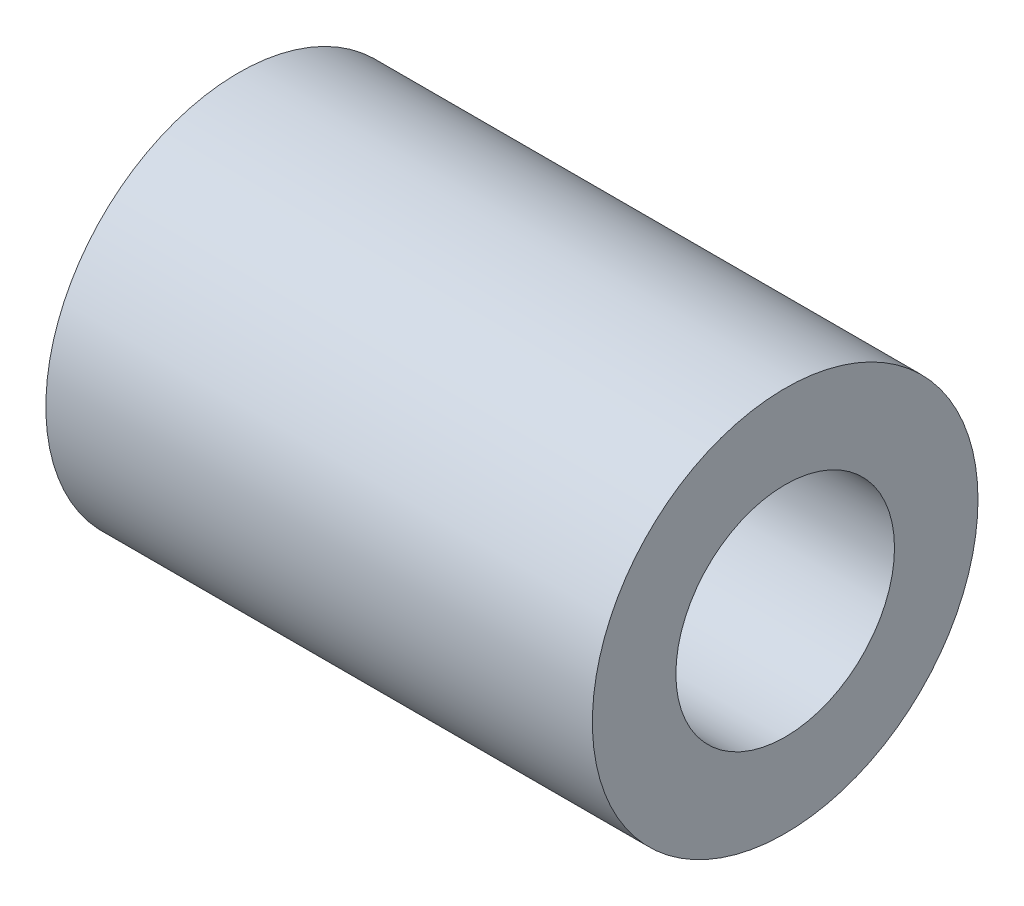
ISO-10303-21;
HEADER;
FILE_DESCRIPTION(('STEP AP214'),'2;1');
FILE_NAME('part.step','',(''),(''),'','','');
FILE_SCHEMA(('AUTOMOTIVE_DESIGN { 1 0 10303 214 1 1 1 1 }'));
ENDSEC;
DATA;
#1=APPLICATION_CONTEXT('core data for automotive mechanical design processes');
#2=APPLICATION_PROTOCOL_DEFINITION('international standard','automotive_design',2000,#1);
#3=PRODUCT_CONTEXT('',#1,'mechanical');
#4=PRODUCT('Part','Part','',(#3));
#5=PRODUCT_RELATED_PRODUCT_CATEGORY('part','',(#4));
#6=PRODUCT_DEFINITION_FORMATION('','',#4);
#7=PRODUCT_DEFINITION_CONTEXT('part definition',#1,'design');
#8=PRODUCT_DEFINITION('design','',#6,#7);
#9=PRODUCT_DEFINITION_SHAPE('','',#8);
#10=(LENGTH_UNIT() NAMED_UNIT(*) SI_UNIT(.MILLI.,.METRE.));
#11=(NAMED_UNIT(*) PLANE_ANGLE_UNIT() SI_UNIT($,.RADIAN.));
#12=(NAMED_UNIT(*) SI_UNIT($,.STERADIAN.) SOLID_ANGLE_UNIT());
#13=UNCERTAINTY_MEASURE_WITH_UNIT(LENGTH_MEASURE(1.E-05),#10,'distance_accuracy_value','');
#14=(GEOMETRIC_REPRESENTATION_CONTEXT(3) GLOBAL_UNCERTAINTY_ASSIGNED_CONTEXT((#13)) GLOBAL_UNIT_ASSIGNED_CONTEXT((#10,
#11,#12)) REPRESENTATION_CONTEXT('',''));
#15=CARTESIAN_POINT('',(0.,0.,0.));
#16=DIRECTION('',(0.,0.,1.));
#17=DIRECTION('',(1.,0.,0.));
#18=AXIS2_PLACEMENT_3D('',#15,#16,#17);
#19=CARTESIAN_POINT('',(9.,0.,0.));
#20=DIRECTION('',(1.,0.,0.));
#21=DIRECTION('',(0.,0.,-1.));
#22=AXIS2_PLACEMENT_3D('',#19,#20,#21);
#23=PLANE('',#22);
#24=CARTESIAN_POINT('',(9.,0.,0.));
#25=DIRECTION('',(1.,0.,0.));
#26=DIRECTION('',(0.,0.,-1.));
#27=AXIS2_PLACEMENT_3D('',#24,#25,#26);
#28=CIRCLE('',#27,3.175);
#29=CARTESIAN_POINT('',(9.,0.,-3.175));
#30=VERTEX_POINT('',#29);
#31=EDGE_CURVE('E10',#30,#30,#28,.T.);
#32=ORIENTED_EDGE('',*,*,#31,.T.);
#33=EDGE_LOOP('',(#32));
#34=FACE_BOUND('',#33,.T.);
#35=CARTESIAN_POINT('',(9.,0.,0.));
#36=DIRECTION('',(1.,0.,0.));
#37=DIRECTION('',(0.,0.,-1.));
#38=AXIS2_PLACEMENT_3D('',#35,#36,#37);
#39=CIRCLE('',#38,1.8);
#40=CARTESIAN_POINT('',(9.,0.,-1.8));
#41=VERTEX_POINT('',#40);
#42=EDGE_CURVE('E41',#41,#41,#39,.T.);
#43=ORIENTED_EDGE('',*,*,#42,.F.);
#44=EDGE_LOOP('',(#43));
#45=FACE_BOUND('',#44,.T.);
#46=ADVANCED_FACE('F30',(#34,#45),#23,.T.);
#47=CARTESIAN_POINT('',(0.,0.,0.));
#48=DIRECTION('',(1.,0.,0.));
#49=DIRECTION('',(0.,0.,-1.));
#50=AXIS2_PLACEMENT_3D('',#47,#48,#49);
#51=PLANE('',#50);
#52=CARTESIAN_POINT('',(0.,0.,0.));
#53=DIRECTION('',(1.,0.,0.));
#54=DIRECTION('',(0.,0.,-1.));
#55=AXIS2_PLACEMENT_3D('',#52,#53,#54);
#56=CIRCLE('',#55,3.175);
#57=CARTESIAN_POINT('',(0.,0.,-3.175));
#58=VERTEX_POINT('',#57);
#59=EDGE_CURVE('E34',#58,#58,#56,.T.);
#60=ORIENTED_EDGE('',*,*,#59,.F.);
#61=EDGE_LOOP('',(#60));
#62=FACE_BOUND('',#61,.T.);
#63=CARTESIAN_POINT('',(0.,0.,0.));
#64=DIRECTION('',(1.,0.,0.));
#65=DIRECTION('',(0.,0.,-1.));
#66=AXIS2_PLACEMENT_3D('',#63,#64,#65);
#67=CIRCLE('',#66,1.8);
#68=CARTESIAN_POINT('',(0.,0.,-1.8));
#69=VERTEX_POINT('',#68);
#70=EDGE_CURVE('E43',#69,#69,#67,.T.);
#71=ORIENTED_EDGE('',*,*,#70,.T.);
#72=EDGE_LOOP('',(#71));
#73=FACE_BOUND('',#72,.T.);
#74=ADVANCED_FACE('F53',(#62,#73),#51,.F.);
#75=CARTESIAN_POINT('',(9.,0.,0.));
#76=DIRECTION('',(-1.,0.,0.));
#77=DIRECTION('',(0.,0.,1.));
#78=AXIS2_PLACEMENT_3D('',#75,#76,#77);
#79=CYLINDRICAL_SURFACE('',#78,3.175);
#80=ORIENTED_EDGE('',*,*,#31,.F.);
#81=EDGE_LOOP('',(#80));
#82=FACE_BOUND('',#81,.T.);
#83=ORIENTED_EDGE('',*,*,#59,.T.);
#84=EDGE_LOOP('',(#83));
#85=FACE_BOUND('',#84,.T.);
#86=ADVANCED_FACE('F32',(#82,#85),#79,.T.);
#87=CARTESIAN_POINT('',(9.,0.,0.));
#88=DIRECTION('',(-1.,0.,0.));
#89=DIRECTION('',(0.,0.,1.));
#90=AXIS2_PLACEMENT_3D('',#87,#88,#89);
#91=CYLINDRICAL_SURFACE('',#90,1.8);
#92=ORIENTED_EDGE('',*,*,#42,.T.);
#93=EDGE_LOOP('',(#92));
#94=FACE_BOUND('',#93,.T.);
#95=ORIENTED_EDGE('',*,*,#70,.F.);
#96=EDGE_LOOP('',(#95));
#97=FACE_BOUND('',#96,.T.);
#98=ADVANCED_FACE('F49',(#94,#97),#91,.F.);
#99=CLOSED_SHELL('',(#46,#74,#86,#98));
#100=MANIFOLD_SOLID_BREP('B2',#99);
#101=ADVANCED_BREP_SHAPE_REPRESENTATION('',(#18,#100),#14);
#102=SHAPE_DEFINITION_REPRESENTATION(#9,#101);
ENDSEC;
END-ISO-10303-21;
